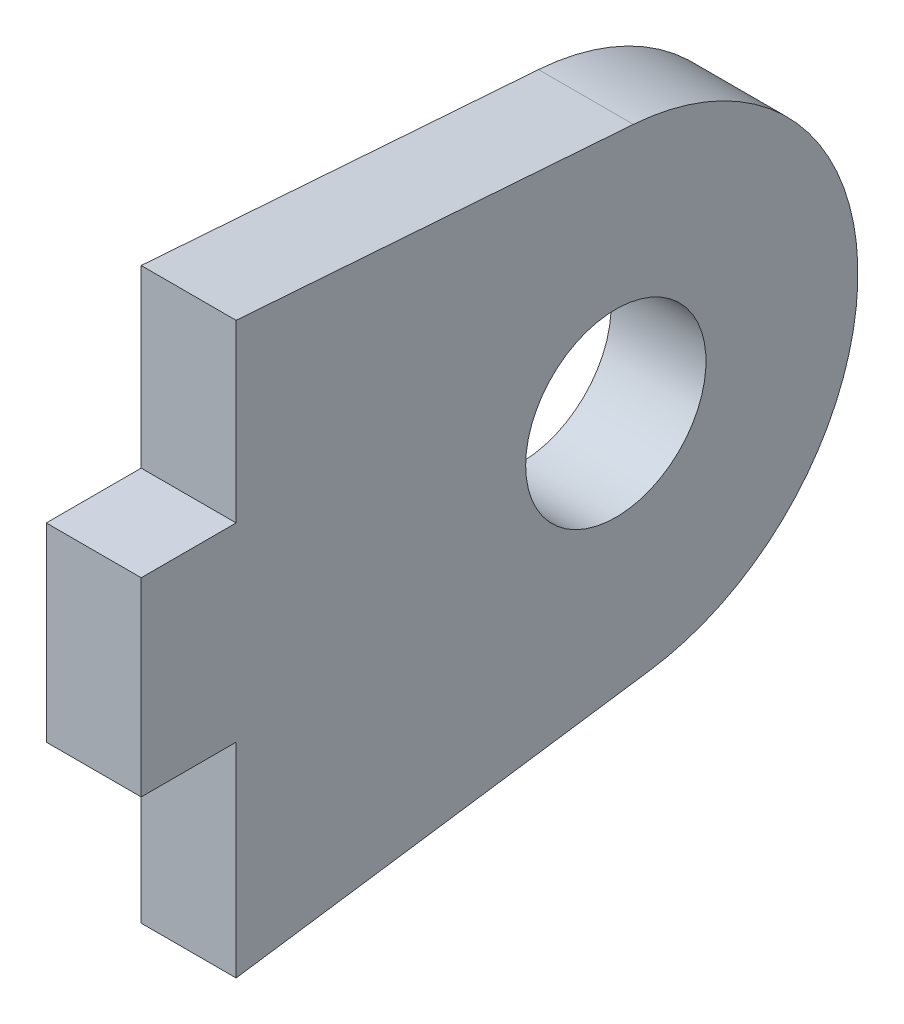
ISO-10303-21;
HEADER;
FILE_DESCRIPTION(('STEP AP214'),'2;1');
FILE_NAME('part.step','',(''),(''),'','','');
FILE_SCHEMA(('AUTOMOTIVE_DESIGN { 1 0 10303 214 1 1 1 1 }'));
ENDSEC;
DATA;
#1=APPLICATION_CONTEXT('core data for automotive mechanical design processes');
#2=APPLICATION_PROTOCOL_DEFINITION('international standard','automotive_design',2000,#1);
#3=PRODUCT_CONTEXT('',#1,'mechanical');
#4=PRODUCT('Part','Part','',(#3));
#5=PRODUCT_RELATED_PRODUCT_CATEGORY('part','',(#4));
#6=PRODUCT_DEFINITION_FORMATION('','',#4);
#7=PRODUCT_DEFINITION_CONTEXT('part definition',#1,'design');
#8=PRODUCT_DEFINITION('design','',#6,#7);
#9=PRODUCT_DEFINITION_SHAPE('','',#8);
#10=(LENGTH_UNIT() NAMED_UNIT(*) SI_UNIT(.MILLI.,.METRE.));
#11=(NAMED_UNIT(*) PLANE_ANGLE_UNIT() SI_UNIT($,.RADIAN.));
#12=(NAMED_UNIT(*) SI_UNIT($,.STERADIAN.) SOLID_ANGLE_UNIT());
#13=UNCERTAINTY_MEASURE_WITH_UNIT(LENGTH_MEASURE(1.E-05),#10,'distance_accuracy_value','');
#14=(GEOMETRIC_REPRESENTATION_CONTEXT(3) GLOBAL_UNCERTAINTY_ASSIGNED_CONTEXT((#13)) GLOBAL_UNIT_ASSIGNED_CONTEXT((#10,
#11,#12)) REPRESENTATION_CONTEXT('',''));
#15=CARTESIAN_POINT('',(0.,0.,0.));
#16=DIRECTION('',(0.,0.,1.));
#17=DIRECTION('',(1.,0.,0.));
#18=AXIS2_PLACEMENT_3D('',#15,#16,#17);
#19=CARTESIAN_POINT('',(2.5,0.,-20.));
#20=DIRECTION('',(1.,0.,0.));
#21=DIRECTION('',(0.,0.,1.));
#22=AXIS2_PLACEMENT_3D('',#19,#20,#21);
#23=PLANE('',#22);
#24=DIRECTION('',(0.,1.,0.));
#25=VECTOR('',#24,1.);
#26=CARTESIAN_POINT('',(2.5,5.,0.));
#27=LINE('',#26,#25);
#28=CARTESIAN_POINT('',(2.5,5.,0.));
#29=VERTEX_POINT('',#28);
#30=CARTESIAN_POINT('',(2.5,14.2422824883128,0.));
#31=VERTEX_POINT('',#30);
#32=EDGE_CURVE('E164',#29,#31,#27,.T.);
#33=ORIENTED_EDGE('',*,*,#32,.F.);
#34=DIRECTION('',(0.,0.,-1.));
#35=VECTOR('',#34,1.);
#36=CARTESIAN_POINT('',(2.5,5.,5.));
#37=LINE('',#36,#35);
#38=CARTESIAN_POINT('',(2.5,5.,5.));
#39=VERTEX_POINT('',#38);
#40=EDGE_CURVE('E136',#39,#29,#37,.T.);
#41=ORIENTED_EDGE('',*,*,#40,.F.);
#42=DIRECTION('',(0.,1.,0.));
#43=VECTOR('',#42,1.);
#44=CARTESIAN_POINT('',(2.5,5.,5.));
#45=LINE('',#44,#43);
#46=CARTESIAN_POINT('',(2.5,-5.,5.));
#47=VERTEX_POINT('',#46);
#48=EDGE_CURVE('E117',#47,#39,#45,.T.);
#49=ORIENTED_EDGE('',*,*,#48,.F.);
#50=DIRECTION('',(0.,0.,1.));
#51=VECTOR('',#50,1.);
#52=CARTESIAN_POINT('',(2.5,-5.,5.));
#53=LINE('',#52,#51);
#54=CARTESIAN_POINT('',(2.5,-5.,0.));
#55=VERTEX_POINT('',#54);
#56=EDGE_CURVE('E127',#55,#47,#53,.T.);
#57=ORIENTED_EDGE('',*,*,#56,.F.);
#58=DIRECTION('',(0.,1.,0.));
#59=VECTOR('',#58,1.);
#60=CARTESIAN_POINT('',(2.5,-15.7577175116872,0.));
#61=LINE('',#60,#59);
#62=CARTESIAN_POINT('',(2.5,-15.7577175116872,0.));
#63=VERTEX_POINT('',#62);
#64=EDGE_CURVE('E132',#63,#55,#61,.T.);
#65=ORIENTED_EDGE('',*,*,#64,.F.);
#66=DIRECTION('',(0.,-0.142361092787071,0.989814790382762));
#67=VECTOR('',#66,1.);
#68=CARTESIAN_POINT('',(2.5,-15.7577175116872,0.));
#69=LINE('',#68,#67);
#70=CARTESIAN_POINT('',(2.5,-12.6201385773802,-21.8151039330352));
#71=VERTEX_POINT('',#70);
#72=EDGE_CURVE('E151',#71,#63,#69,.T.);
#73=ORIENTED_EDGE('',*,*,#72,.F.);
#74=CARTESIAN_POINT('',(2.5,0.,-20.));
#75=DIRECTION('',(-1.,0.,0.));
#76=DIRECTION('',(0.,0.,1.));
#77=AXIS2_PLACEMENT_3D('',#74,#75,#76);
#78=CIRCLE('',#77,12.75);
#79=CARTESIAN_POINT('',(2.5,12.7162353337246,-20.9272857905385));
#80=VERTEX_POINT('',#79);
#81=EDGE_CURVE('E155',#80,#71,#78,.T.);
#82=ORIENTED_EDGE('',*,*,#81,.F.);
#83=DIRECTION('',(0.,-0.0727282972971378,-0.997351790880359));
#84=VECTOR('',#83,1.);
#85=CARTESIAN_POINT('',(2.5,14.2422824883128,0.));
#86=LINE('',#85,#84);
#87=EDGE_CURVE('E159',#31,#80,#86,.T.);
#88=ORIENTED_EDGE('',*,*,#87,.F.);
#89=EDGE_LOOP('',(#33,#41,#49,#57,#65,#73,#82,#88));
#90=FACE_BOUND('',#89,.T.);
#91=CARTESIAN_POINT('',(2.5,0.,-20.));
#92=DIRECTION('',(-1.,0.,0.));
#93=DIRECTION('',(0.,0.,1.));
#94=AXIS2_PLACEMENT_3D('',#91,#92,#93);
#95=CIRCLE('',#94,4.75);
#96=CARTESIAN_POINT('',(2.5,0.,-15.25));
#97=VERTEX_POINT('',#96);
#98=EDGE_CURVE('E170',#97,#97,#95,.T.);
#99=ORIENTED_EDGE('',*,*,#98,.T.);
#100=EDGE_LOOP('',(#99));
#101=FACE_BOUND('',#100,.T.);
#102=ADVANCED_FACE('F44',(#90,#101),#23,.T.);
#103=CARTESIAN_POINT('',(-2.5,0.,-20.));
#104=DIRECTION('',(1.,0.,0.));
#105=DIRECTION('',(0.,0.,1.));
#106=AXIS2_PLACEMENT_3D('',#103,#104,#105);
#107=PLANE('',#106);
#108=DIRECTION('',(0.,1.,0.));
#109=VECTOR('',#108,1.);
#110=CARTESIAN_POINT('',(-2.5,5.,0.));
#111=LINE('',#110,#109);
#112=CARTESIAN_POINT('',(-2.5,5.,0.));
#113=VERTEX_POINT('',#112);
#114=CARTESIAN_POINT('',(-2.5,14.2422824883128,0.));
#115=VERTEX_POINT('',#114);
#116=EDGE_CURVE('E173',#113,#115,#111,.T.);
#117=ORIENTED_EDGE('',*,*,#116,.T.);
#118=DIRECTION('',(0.,-0.0727282972971378,-0.997351790880359));
#119=VECTOR('',#118,1.);
#120=CARTESIAN_POINT('',(-2.5,14.2422824883128,0.));
#121=LINE('',#120,#119);
#122=CARTESIAN_POINT('',(-2.5,12.7162353337246,-20.9272857905385));
#123=VERTEX_POINT('',#122);
#124=EDGE_CURVE('E176',#115,#123,#121,.T.);
#125=ORIENTED_EDGE('',*,*,#124,.T.);
#126=CARTESIAN_POINT('',(-2.5,0.,-20.));
#127=DIRECTION('',(-1.,0.,0.));
#128=DIRECTION('',(0.,0.,1.));
#129=AXIS2_PLACEMENT_3D('',#126,#127,#128);
#130=CIRCLE('',#129,12.75);
#131=CARTESIAN_POINT('',(-2.5,-12.6201385773802,-21.8151039330352));
#132=VERTEX_POINT('',#131);
#133=EDGE_CURVE('E179',#123,#132,#130,.T.);
#134=ORIENTED_EDGE('',*,*,#133,.T.);
#135=DIRECTION('',(0.,-0.142361092787071,0.989814790382762));
#136=VECTOR('',#135,1.);
#137=CARTESIAN_POINT('',(-2.5,-15.7577175116872,0.));
#138=LINE('',#137,#136);
#139=CARTESIAN_POINT('',(-2.5,-15.7577175116872,0.));
#140=VERTEX_POINT('',#139);
#141=EDGE_CURVE('E184',#132,#140,#138,.T.);
#142=ORIENTED_EDGE('',*,*,#141,.T.);
#143=DIRECTION('',(0.,1.,0.));
#144=VECTOR('',#143,1.);
#145=CARTESIAN_POINT('',(-2.5,-15.7577175116872,0.));
#146=LINE('',#145,#144);
#147=CARTESIAN_POINT('',(-2.5,-5.,0.));
#148=VERTEX_POINT('',#147);
#149=EDGE_CURVE('E187',#140,#148,#146,.T.);
#150=ORIENTED_EDGE('',*,*,#149,.T.);
#151=DIRECTION('',(0.,0.,1.));
#152=VECTOR('',#151,1.);
#153=CARTESIAN_POINT('',(-2.5,-5.,5.));
#154=LINE('',#153,#152);
#155=CARTESIAN_POINT('',(-2.5,-5.,5.));
#156=VERTEX_POINT('',#155);
#157=EDGE_CURVE('E190',#148,#156,#154,.T.);
#158=ORIENTED_EDGE('',*,*,#157,.T.);
#159=DIRECTION('',(0.,1.,0.));
#160=VECTOR('',#159,1.);
#161=CARTESIAN_POINT('',(-2.5,5.,5.));
#162=LINE('',#161,#160);
#163=CARTESIAN_POINT('',(-2.5,5.,5.));
#164=VERTEX_POINT('',#163);
#165=EDGE_CURVE('E120',#156,#164,#162,.T.);
#166=ORIENTED_EDGE('',*,*,#165,.T.);
#167=DIRECTION('',(0.,0.,-1.));
#168=VECTOR('',#167,1.);
#169=CARTESIAN_POINT('',(-2.5,5.,5.));
#170=LINE('',#169,#168);
#171=EDGE_CURVE('E167',#164,#113,#170,.T.);
#172=ORIENTED_EDGE('',*,*,#171,.T.);
#173=EDGE_LOOP('',(#117,#125,#134,#142,#150,#158,#166,#172));
#174=FACE_BOUND('',#173,.T.);
#175=CARTESIAN_POINT('',(-2.5,0.,-20.));
#176=DIRECTION('',(-1.,0.,0.));
#177=DIRECTION('',(0.,0.,1.));
#178=AXIS2_PLACEMENT_3D('',#175,#176,#177);
#179=CIRCLE('',#178,4.75);
#180=CARTESIAN_POINT('',(-2.5,0.,-15.25));
#181=VERTEX_POINT('',#180);
#182=EDGE_CURVE('E168',#181,#181,#179,.T.);
#183=ORIENTED_EDGE('',*,*,#182,.F.);
#184=EDGE_LOOP('',(#183));
#185=FACE_BOUND('',#184,.T.);
#186=ADVANCED_FACE('F206',(#174,#185),#107,.F.);
#187=CARTESIAN_POINT('',(2.5,5.,0.));
#188=DIRECTION('',(0.,0.,-1.));
#189=DIRECTION('',(1.,0.,0.));
#190=AXIS2_PLACEMENT_3D('',#187,#188,#189);
#191=PLANE('',#190);
#192=ORIENTED_EDGE('',*,*,#116,.F.);
#193=DIRECTION('',(-1.,0.,0.));
#194=VECTOR('',#193,1.);
#195=CARTESIAN_POINT('',(2.5,5.,0.));
#196=LINE('',#195,#194);
#197=EDGE_CURVE('E61',#29,#113,#196,.T.);
#198=ORIENTED_EDGE('',*,*,#197,.F.);
#199=ORIENTED_EDGE('',*,*,#32,.T.);
#200=DIRECTION('',(-1.,0.,0.));
#201=VECTOR('',#200,1.);
#202=CARTESIAN_POINT('',(2.5,14.2422824883128,0.));
#203=LINE('',#202,#201);
#204=EDGE_CURVE('E12',#31,#115,#203,.T.);
#205=ORIENTED_EDGE('',*,*,#204,.T.);
#206=EDGE_LOOP('',(#192,#198,#199,#205));
#207=FACE_BOUND('',#206,.T.);
#208=ADVANCED_FACE('F46',(#207),#191,.F.);
#209=CARTESIAN_POINT('',(2.5,14.2422824883128,0.));
#210=DIRECTION('',(0.,-0.997351790880359,0.0727282972971378));
#211=DIRECTION('',(0.,0.0727282972971378,0.997351790880359));
#212=AXIS2_PLACEMENT_3D('',#209,#210,#211);
#213=PLANE('',#212);
#214=ORIENTED_EDGE('',*,*,#124,.F.);
#215=ORIENTED_EDGE('',*,*,#204,.F.);
#216=ORIENTED_EDGE('',*,*,#87,.T.);
#217=DIRECTION('',(-1.,0.,0.));
#218=VECTOR('',#217,1.);
#219=CARTESIAN_POINT('',(2.5,12.7162353337246,-20.9272857905385));
#220=LINE('',#219,#218);
#221=EDGE_CURVE('E53',#80,#123,#220,.T.);
#222=ORIENTED_EDGE('',*,*,#221,.T.);
#223=EDGE_LOOP('',(#214,#215,#216,#222));
#224=FACE_BOUND('',#223,.T.);
#225=ADVANCED_FACE('F201',(#224),#213,.F.);
#226=CARTESIAN_POINT('',(2.5,0.,-20.));
#227=DIRECTION('',(-1.,0.,0.));
#228=DIRECTION('',(0.,0.,-1.));
#229=AXIS2_PLACEMENT_3D('',#226,#227,#228);
#230=CYLINDRICAL_SURFACE('',#229,12.75);
#231=ORIENTED_EDGE('',*,*,#133,.F.);
#232=ORIENTED_EDGE('',*,*,#221,.F.);
#233=ORIENTED_EDGE('',*,*,#81,.T.);
#234=DIRECTION('',(-1.,0.,0.));
#235=VECTOR('',#234,1.);
#236=CARTESIAN_POINT('',(2.5,-12.6201385773802,-21.8151039330352));
#237=LINE('',#236,#235);
#238=EDGE_CURVE('E199',#71,#132,#237,.T.);
#239=ORIENTED_EDGE('',*,*,#238,.T.);
#240=EDGE_LOOP('',(#231,#232,#233,#239));
#241=FACE_BOUND('',#240,.T.);
#242=ADVANCED_FACE('F204',(#241),#230,.T.);
#243=CARTESIAN_POINT('',(2.5,-15.7577175116872,0.));
#244=DIRECTION('',(0.,0.989814790382762,0.142361092787071));
#245=DIRECTION('',(0.,0.142361092787071,-0.989814790382762));
#246=AXIS2_PLACEMENT_3D('',#243,#244,#245);
#247=PLANE('',#246);
#248=ORIENTED_EDGE('',*,*,#141,.F.);
#249=ORIENTED_EDGE('',*,*,#238,.F.);
#250=ORIENTED_EDGE('',*,*,#72,.T.);
#251=DIRECTION('',(-1.,0.,0.));
#252=VECTOR('',#251,1.);
#253=CARTESIAN_POINT('',(2.5,-15.7577175116872,0.));
#254=LINE('',#253,#252);
#255=EDGE_CURVE('E197',#63,#140,#254,.T.);
#256=ORIENTED_EDGE('',*,*,#255,.T.);
#257=EDGE_LOOP('',(#248,#249,#250,#256));
#258=FACE_BOUND('',#257,.T.);
#259=ADVANCED_FACE('F233',(#258),#247,.F.);
#260=CARTESIAN_POINT('',(2.5,-15.7577175116872,0.));
#261=DIRECTION('',(0.,0.,-1.));
#262=DIRECTION('',(1.,0.,0.));
#263=AXIS2_PLACEMENT_3D('',#260,#261,#262);
#264=PLANE('',#263);
#265=ORIENTED_EDGE('',*,*,#149,.F.);
#266=ORIENTED_EDGE('',*,*,#255,.F.);
#267=ORIENTED_EDGE('',*,*,#64,.T.);
#268=DIRECTION('',(-1.,0.,0.));
#269=VECTOR('',#268,1.);
#270=CARTESIAN_POINT('',(2.5,-5.,0.));
#271=LINE('',#270,#269);
#272=EDGE_CURVE('E124',#55,#148,#271,.T.);
#273=ORIENTED_EDGE('',*,*,#272,.T.);
#274=EDGE_LOOP('',(#265,#266,#267,#273));
#275=FACE_BOUND('',#274,.T.);
#276=ADVANCED_FACE('F230',(#275),#264,.F.);
#277=CARTESIAN_POINT('',(2.5,-5.,5.));
#278=DIRECTION('',(0.,1.,0.));
#279=DIRECTION('',(0.,0.,-1.));
#280=AXIS2_PLACEMENT_3D('',#277,#278,#279);
#281=PLANE('',#280);
#282=ORIENTED_EDGE('',*,*,#157,.F.);
#283=ORIENTED_EDGE('',*,*,#272,.F.);
#284=ORIENTED_EDGE('',*,*,#56,.T.);
#285=DIRECTION('',(-1.,0.,0.));
#286=VECTOR('',#285,1.);
#287=CARTESIAN_POINT('',(2.5,-5.,5.));
#288=LINE('',#287,#286);
#289=EDGE_CURVE('E113',#47,#156,#288,.T.);
#290=ORIENTED_EDGE('',*,*,#289,.T.);
#291=EDGE_LOOP('',(#282,#283,#284,#290));
#292=FACE_BOUND('',#291,.T.);
#293=ADVANCED_FACE('F128',(#292),#281,.F.);
#294=CARTESIAN_POINT('',(2.5,5.,5.));
#295=DIRECTION('',(0.,0.,-1.));
#296=DIRECTION('',(0.,-1.,0.));
#297=AXIS2_PLACEMENT_3D('',#294,#295,#296);
#298=PLANE('',#297);
#299=ORIENTED_EDGE('',*,*,#165,.F.);
#300=ORIENTED_EDGE('',*,*,#289,.F.);
#301=ORIENTED_EDGE('',*,*,#48,.T.);
#302=DIRECTION('',(-1.,0.,0.));
#303=VECTOR('',#302,1.);
#304=CARTESIAN_POINT('',(2.5,5.,5.));
#305=LINE('',#304,#303);
#306=EDGE_CURVE('E89',#39,#164,#305,.T.);
#307=ORIENTED_EDGE('',*,*,#306,.T.);
#308=EDGE_LOOP('',(#299,#300,#301,#307));
#309=FACE_BOUND('',#308,.T.);
#310=ADVANCED_FACE('F115',(#309),#298,.F.);
#311=CARTESIAN_POINT('',(2.5,5.,5.));
#312=DIRECTION('',(0.,-1.,0.));
#313=DIRECTION('',(0.,0.,1.));
#314=AXIS2_PLACEMENT_3D('',#311,#312,#313);
#315=PLANE('',#314);
#316=ORIENTED_EDGE('',*,*,#171,.F.);
#317=ORIENTED_EDGE('',*,*,#306,.F.);
#318=ORIENTED_EDGE('',*,*,#40,.T.);
#319=ORIENTED_EDGE('',*,*,#197,.T.);
#320=EDGE_LOOP('',(#316,#317,#318,#319));
#321=FACE_BOUND('',#320,.T.);
#322=ADVANCED_FACE('F214',(#321),#315,.F.);
#323=CARTESIAN_POINT('',(2.5,0.,-20.));
#324=DIRECTION('',(-1.,0.,0.));
#325=DIRECTION('',(0.,0.,-1.));
#326=AXIS2_PLACEMENT_3D('',#323,#324,#325);
#327=CYLINDRICAL_SURFACE('',#326,4.75);
#328=ORIENTED_EDGE('',*,*,#98,.F.);
#329=EDGE_LOOP('',(#328));
#330=FACE_BOUND('',#329,.T.);
#331=ORIENTED_EDGE('',*,*,#182,.T.);
#332=EDGE_LOOP('',(#331));
#333=FACE_BOUND('',#332,.T.);
#334=ADVANCED_FACE('F212',(#330,#333),#327,.F.);
#335=CLOSED_SHELL('',(#102,#186,#208,#225,#242,#259,#276,#293,#310,#322,#334));
#336=MANIFOLD_SOLID_BREP('B2',#335);
#337=ADVANCED_BREP_SHAPE_REPRESENTATION('',(#18,#336),#14);
#338=SHAPE_DEFINITION_REPRESENTATION(#9,#337);
ENDSEC;
END-ISO-10303-21;
